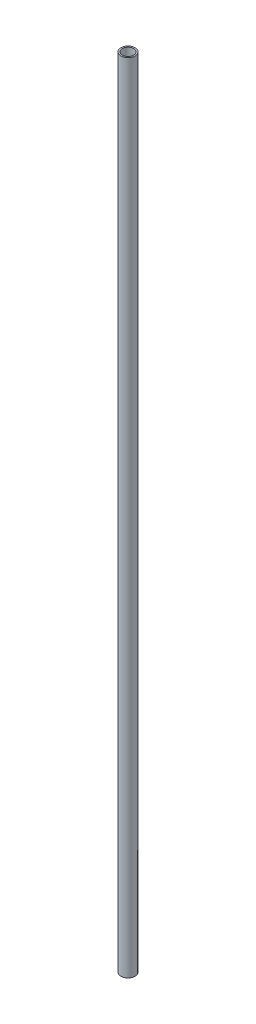
ISO-10303-21;
HEADER;
FILE_DESCRIPTION(('STEP AP214'),'2;1');
FILE_NAME('part.step','',(''),(''),'','','');
FILE_SCHEMA(('AUTOMOTIVE_DESIGN { 1 0 10303 214 1 1 1 1 }'));
ENDSEC;
DATA;
#1=APPLICATION_CONTEXT('core data for automotive mechanical design processes');
#2=APPLICATION_PROTOCOL_DEFINITION('international standard','automotive_design',2000,#1);
#3=PRODUCT_CONTEXT('',#1,'mechanical');
#4=PRODUCT('Part','Part','',(#3));
#5=PRODUCT_RELATED_PRODUCT_CATEGORY('part','',(#4));
#6=PRODUCT_DEFINITION_FORMATION('','',#4);
#7=PRODUCT_DEFINITION_CONTEXT('part definition',#1,'design');
#8=PRODUCT_DEFINITION('design','',#6,#7);
#9=PRODUCT_DEFINITION_SHAPE('','',#8);
#10=(LENGTH_UNIT() NAMED_UNIT(*) SI_UNIT(.MILLI.,.METRE.));
#11=(NAMED_UNIT(*) PLANE_ANGLE_UNIT() SI_UNIT($,.RADIAN.));
#12=(NAMED_UNIT(*) SI_UNIT($,.STERADIAN.) SOLID_ANGLE_UNIT());
#13=UNCERTAINTY_MEASURE_WITH_UNIT(LENGTH_MEASURE(1.E-05),#10,'distance_accuracy_value','');
#14=(GEOMETRIC_REPRESENTATION_CONTEXT(3) GLOBAL_UNCERTAINTY_ASSIGNED_CONTEXT((#13)) GLOBAL_UNIT_ASSIGNED_CONTEXT((#10,
#11,#12)) REPRESENTATION_CONTEXT('',''));
#15=CARTESIAN_POINT('',(0.,0.,0.));
#16=DIRECTION('',(0.,0.,1.));
#17=DIRECTION('',(1.,0.,0.));
#18=AXIS2_PLACEMENT_3D('',#15,#16,#17);
#19=CARTESIAN_POINT('',(0.,355.6,0.));
#20=DIRECTION('',(0.,1.,0.));
#21=DIRECTION('',(0.,0.,1.));
#22=AXIS2_PLACEMENT_3D('',#19,#20,#21);
#23=PLANE('',#22);
#24=CARTESIAN_POINT('',(0.,355.6,0.));
#25=DIRECTION('',(0.,1.,0.));
#26=DIRECTION('',(0.,0.,1.));
#27=AXIS2_PLACEMENT_3D('',#24,#25,#26);
#28=CIRCLE('',#27,3.175);
#29=CARTESIAN_POINT('',(0.,355.6,3.175));
#30=VERTEX_POINT('',#29);
#31=EDGE_CURVE('E10',#30,#30,#28,.T.);
#32=ORIENTED_EDGE('',*,*,#31,.T.);
#33=EDGE_LOOP('',(#32));
#34=FACE_BOUND('',#33,.T.);
#35=CARTESIAN_POINT('',(0.,355.6,0.));
#36=DIRECTION('',(0.,1.,0.));
#37=DIRECTION('',(0.,0.,1.));
#38=AXIS2_PLACEMENT_3D('',#35,#36,#37);
#39=CIRCLE('',#38,2.54);
#40=CARTESIAN_POINT('',(0.,355.6,2.54));
#41=VERTEX_POINT('',#40);
#42=EDGE_CURVE('E50',#41,#41,#39,.T.);
#43=ORIENTED_EDGE('',*,*,#42,.F.);
#44=EDGE_LOOP('',(#43));
#45=FACE_BOUND('',#44,.T.);
#46=ADVANCED_FACE('F37',(#34,#45),#23,.T.);
#47=CARTESIAN_POINT('',(0.,0.,0.));
#48=DIRECTION('',(0.,1.,0.));
#49=DIRECTION('',(0.,0.,1.));
#50=AXIS2_PLACEMENT_3D('',#47,#48,#49);
#51=PLANE('',#50);
#52=CARTESIAN_POINT('',(0.,0.,0.));
#53=DIRECTION('',(0.,1.,0.));
#54=DIRECTION('',(0.,0.,1.));
#55=AXIS2_PLACEMENT_3D('',#52,#53,#54);
#56=CIRCLE('',#55,3.175);
#57=CARTESIAN_POINT('',(0.,0.,3.175));
#58=VERTEX_POINT('',#57);
#59=EDGE_CURVE('E41',#58,#58,#56,.T.);
#60=ORIENTED_EDGE('',*,*,#59,.F.);
#61=EDGE_LOOP('',(#60));
#62=FACE_BOUND('',#61,.T.);
#63=CARTESIAN_POINT('',(0.,0.,0.));
#64=DIRECTION('',(0.,1.,0.));
#65=DIRECTION('',(0.,0.,1.));
#66=AXIS2_PLACEMENT_3D('',#63,#64,#65);
#67=CIRCLE('',#66,2.54);
#68=CARTESIAN_POINT('',(0.,0.,2.54));
#69=VERTEX_POINT('',#68);
#70=EDGE_CURVE('E52',#69,#69,#67,.T.);
#71=ORIENTED_EDGE('',*,*,#70,.T.);
#72=EDGE_LOOP('',(#71));
#73=FACE_BOUND('',#72,.T.);
#74=ADVANCED_FACE('F64',(#62,#73),#51,.F.);
#75=CARTESIAN_POINT('',(0.,355.6,0.));
#76=DIRECTION('',(0.,-1.,0.));
#77=DIRECTION('',(0.,0.,-1.));
#78=AXIS2_PLACEMENT_3D('',#75,#76,#77);
#79=CYLINDRICAL_SURFACE('',#78,3.175);
#80=ORIENTED_EDGE('',*,*,#31,.F.);
#81=EDGE_LOOP('',(#80));
#82=FACE_BOUND('',#81,.T.);
#83=ORIENTED_EDGE('',*,*,#59,.T.);
#84=EDGE_LOOP('',(#83));
#85=FACE_BOUND('',#84,.T.);
#86=ADVANCED_FACE('F39',(#82,#85),#79,.T.);
#87=CARTESIAN_POINT('',(0.,355.6,0.));
#88=DIRECTION('',(0.,-1.,0.));
#89=DIRECTION('',(0.,0.,-1.));
#90=AXIS2_PLACEMENT_3D('',#87,#88,#89);
#91=CYLINDRICAL_SURFACE('',#90,2.54);
#92=ORIENTED_EDGE('',*,*,#42,.T.);
#93=EDGE_LOOP('',(#92));
#94=FACE_BOUND('',#93,.T.);
#95=ORIENTED_EDGE('',*,*,#70,.F.);
#96=EDGE_LOOP('',(#95));
#97=FACE_BOUND('',#96,.T.);
#98=ADVANCED_FACE('F60',(#94,#97),#91,.F.);
#99=CLOSED_SHELL('',(#46,#74,#86,#98));
#100=MANIFOLD_SOLID_BREP('B2',#99);
#101=ADVANCED_BREP_SHAPE_REPRESENTATION('',(#18,#100),#14);
#102=SHAPE_DEFINITION_REPRESENTATION(#9,#101);
ENDSEC;
END-ISO-10303-21;
